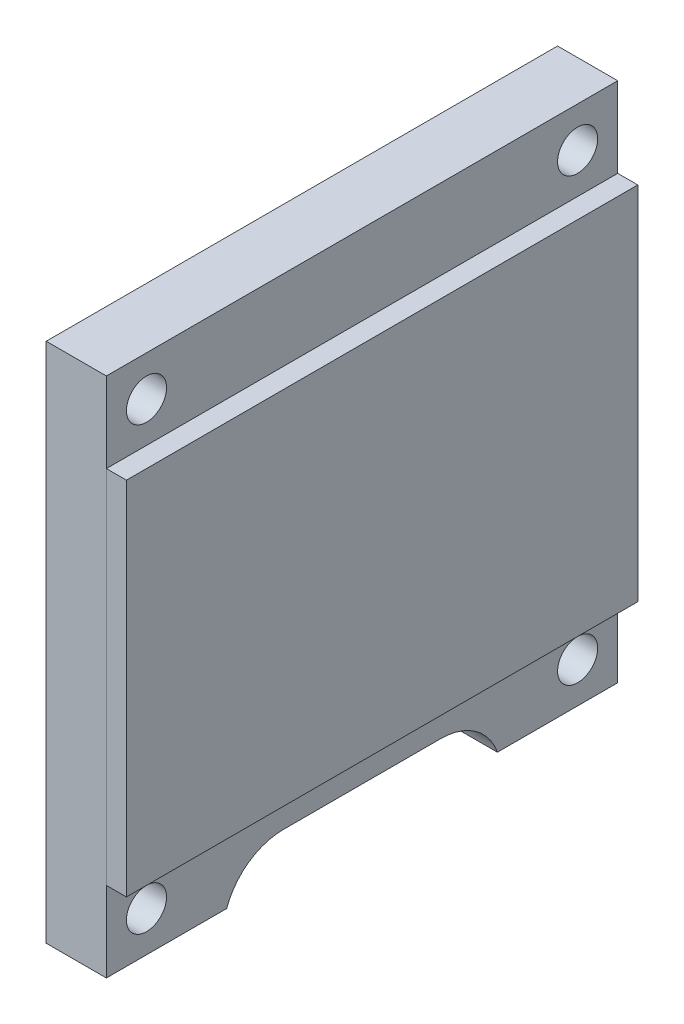
ISO-10303-21;
HEADER;
FILE_DESCRIPTION(('STEP AP214'),'2;1');
FILE_NAME('part.step','',(''),(''),'','','');
FILE_SCHEMA(('AUTOMOTIVE_DESIGN { 1 0 10303 214 1 1 1 1 }'));
ENDSEC;
DATA;
#1=APPLICATION_CONTEXT('core data for automotive mechanical design processes');
#2=APPLICATION_PROTOCOL_DEFINITION('international standard','automotive_design',2000,#1);
#3=PRODUCT_CONTEXT('',#1,'mechanical');
#4=PRODUCT('Part','Part','',(#3));
#5=PRODUCT_RELATED_PRODUCT_CATEGORY('part','',(#4));
#6=PRODUCT_DEFINITION_FORMATION('','',#4);
#7=PRODUCT_DEFINITION_CONTEXT('part definition',#1,'design');
#8=PRODUCT_DEFINITION('design','',#6,#7);
#9=PRODUCT_DEFINITION_SHAPE('','',#8);
#10=(LENGTH_UNIT() NAMED_UNIT(*) SI_UNIT(.MILLI.,.METRE.));
#11=(NAMED_UNIT(*) PLANE_ANGLE_UNIT() SI_UNIT($,.RADIAN.));
#12=(NAMED_UNIT(*) SI_UNIT($,.STERADIAN.) SOLID_ANGLE_UNIT());
#13=UNCERTAINTY_MEASURE_WITH_UNIT(LENGTH_MEASURE(1.E-05),#10,'distance_accuracy_value','');
#14=(GEOMETRIC_REPRESENTATION_CONTEXT(3) GLOBAL_UNCERTAINTY_ASSIGNED_CONTEXT((#13)) GLOBAL_UNIT_ASSIGNED_CONTEXT((#10,
#11,#12)) REPRESENTATION_CONTEXT('',''));
#15=CARTESIAN_POINT('',(0.,0.,0.));
#16=DIRECTION('',(0.,0.,1.));
#17=DIRECTION('',(1.,0.,0.));
#18=AXIS2_PLACEMENT_3D('',#15,#16,#17);
#19=CARTESIAN_POINT('',(4.,-9.,-12.75));
#20=DIRECTION('',(0.,0.,1.));
#21=DIRECTION('',(1.,0.,0.));
#22=AXIS2_PLACEMENT_3D('',#19,#20,#21);
#23=PLANE('',#22);
#24=DIRECTION('',(0.,1.,0.));
#25=VECTOR('',#24,1.);
#26=CARTESIAN_POINT('',(3.,-9.,-12.75));
#27=LINE('',#26,#25);
#28=CARTESIAN_POINT('',(3.,-9.,-12.75));
#29=VERTEX_POINT('',#28);
#30=CARTESIAN_POINT('',(3.,9.,-12.75));
#31=VERTEX_POINT('',#30);
#32=EDGE_CURVE('E116',#29,#31,#27,.T.);
#33=ORIENTED_EDGE('',*,*,#32,.T.);
#34=DIRECTION('',(-1.,0.,0.));
#35=VECTOR('',#34,1.);
#36=CARTESIAN_POINT('',(4.,9.,-12.75));
#37=LINE('',#36,#35);
#38=CARTESIAN_POINT('',(4.,9.,-12.75));
#39=VERTEX_POINT('',#38);
#40=EDGE_CURVE('E12',#39,#31,#37,.T.);
#41=ORIENTED_EDGE('',*,*,#40,.F.);
#42=DIRECTION('',(0.,1.,0.));
#43=VECTOR('',#42,1.);
#44=CARTESIAN_POINT('',(4.,-9.,-12.75));
#45=LINE('',#44,#43);
#46=CARTESIAN_POINT('',(4.,-9.,-12.75));
#47=VERTEX_POINT('',#46);
#48=EDGE_CURVE('E104',#47,#39,#45,.T.);
#49=ORIENTED_EDGE('',*,*,#48,.F.);
#50=DIRECTION('',(-1.,0.,0.));
#51=VECTOR('',#50,1.);
#52=CARTESIAN_POINT('',(4.,-9.,-12.75));
#53=LINE('',#52,#51);
#54=EDGE_CURVE('E112',#47,#29,#53,.T.);
#55=ORIENTED_EDGE('',*,*,#54,.T.);
#56=EDGE_LOOP('',(#33,#41,#49,#55));
#57=FACE_BOUND('',#56,.T.);
#58=ADVANCED_FACE('F53',(#57),#23,.F.);
#59=CARTESIAN_POINT('',(4.,9.,12.75));
#60=DIRECTION('',(0.,-1.,0.));
#61=DIRECTION('',(0.,0.,-1.));
#62=AXIS2_PLACEMENT_3D('',#59,#60,#61);
#63=PLANE('',#62);
#64=DIRECTION('',(0.,0.,1.));
#65=VECTOR('',#64,1.);
#66=CARTESIAN_POINT('',(3.,9.,12.75));
#67=LINE('',#66,#65);
#68=CARTESIAN_POINT('',(3.,9.,12.75));
#69=VERTEX_POINT('',#68);
#70=EDGE_CURVE('E108',#31,#69,#67,.T.);
#71=ORIENTED_EDGE('',*,*,#70,.T.);
#72=DIRECTION('',(-1.,0.,0.));
#73=VECTOR('',#72,1.);
#74=CARTESIAN_POINT('',(4.,9.,12.75));
#75=LINE('',#74,#73);
#76=CARTESIAN_POINT('',(4.,9.,12.75));
#77=VERTEX_POINT('',#76);
#78=EDGE_CURVE('E61',#77,#69,#75,.T.);
#79=ORIENTED_EDGE('',*,*,#78,.F.);
#80=DIRECTION('',(0.,0.,1.));
#81=VECTOR('',#80,1.);
#82=CARTESIAN_POINT('',(4.,9.,12.75));
#83=LINE('',#82,#81);
#84=EDGE_CURVE('E99',#39,#77,#83,.T.);
#85=ORIENTED_EDGE('',*,*,#84,.F.);
#86=ORIENTED_EDGE('',*,*,#40,.T.);
#87=EDGE_LOOP('',(#71,#79,#85,#86));
#88=FACE_BOUND('',#87,.T.);
#89=ADVANCED_FACE('F107',(#88),#63,.F.);
#90=CARTESIAN_POINT('',(4.,-9.,12.75));
#91=DIRECTION('',(0.,0.,-1.));
#92=DIRECTION('',(-1.,0.,0.));
#93=AXIS2_PLACEMENT_3D('',#90,#91,#92);
#94=PLANE('',#93);
#95=DIRECTION('',(0.,-1.,0.));
#96=VECTOR('',#95,1.);
#97=CARTESIAN_POINT('',(3.,-9.,12.75));
#98=LINE('',#97,#96);
#99=CARTESIAN_POINT('',(3.,-9.,12.75));
#100=VERTEX_POINT('',#99);
#101=EDGE_CURVE('E86',#69,#100,#98,.T.);
#102=ORIENTED_EDGE('',*,*,#101,.T.);
#103=DIRECTION('',(-1.,0.,0.));
#104=VECTOR('',#103,1.);
#105=CARTESIAN_POINT('',(4.,-9.,12.75));
#106=LINE('',#105,#104);
#107=CARTESIAN_POINT('',(4.,-9.,12.75));
#108=VERTEX_POINT('',#107);
#109=EDGE_CURVE('E109',#108,#100,#106,.T.);
#110=ORIENTED_EDGE('',*,*,#109,.F.);
#111=DIRECTION('',(0.,-1.,0.));
#112=VECTOR('',#111,1.);
#113=CARTESIAN_POINT('',(4.,-9.,12.75));
#114=LINE('',#113,#112);
#115=EDGE_CURVE('E102',#77,#108,#114,.T.);
#116=ORIENTED_EDGE('',*,*,#115,.F.);
#117=ORIENTED_EDGE('',*,*,#78,.T.);
#118=EDGE_LOOP('',(#102,#110,#116,#117));
#119=FACE_BOUND('',#118,.T.);
#120=ADVANCED_FACE('F110',(#119),#94,.F.);
#121=CARTESIAN_POINT('',(4.,-9.,12.75));
#122=DIRECTION('',(0.,1.,0.));
#123=DIRECTION('',(0.,0.,1.));
#124=AXIS2_PLACEMENT_3D('',#121,#122,#123);
#125=PLANE('',#124);
#126=DIRECTION('',(0.,0.,-1.));
#127=VECTOR('',#126,1.);
#128=CARTESIAN_POINT('',(3.,-9.,12.75));
#129=LINE('',#128,#127);
#130=EDGE_CURVE('E92',#100,#29,#129,.T.);
#131=ORIENTED_EDGE('',*,*,#130,.T.);
#132=ORIENTED_EDGE('',*,*,#54,.F.);
#133=DIRECTION('',(0.,0.,-1.));
#134=VECTOR('',#133,1.);
#135=CARTESIAN_POINT('',(4.,-9.,12.75));
#136=LINE('',#135,#134);
#137=EDGE_CURVE('E69',#108,#47,#136,.T.);
#138=ORIENTED_EDGE('',*,*,#137,.F.);
#139=ORIENTED_EDGE('',*,*,#109,.T.);
#140=EDGE_LOOP('',(#131,#132,#138,#139));
#141=FACE_BOUND('',#140,.T.);
#142=ADVANCED_FACE('F123',(#141),#125,.F.);
#143=CARTESIAN_POINT('',(4.,0.,0.));
#144=DIRECTION('',(-1.,0.,0.));
#145=DIRECTION('',(0.,0.,1.));
#146=AXIS2_PLACEMENT_3D('',#143,#144,#145);
#147=PLANE('',#146);
#148=ORIENTED_EDGE('',*,*,#48,.T.);
#149=ORIENTED_EDGE('',*,*,#84,.T.);
#150=ORIENTED_EDGE('',*,*,#115,.T.);
#151=ORIENTED_EDGE('',*,*,#137,.T.);
#152=EDGE_LOOP('',(#148,#149,#150,#151));
#153=FACE_BOUND('',#152,.T.);
#154=ADVANCED_FACE('F100',(#153),#147,.F.);
#155=CARTESIAN_POINT('',(3.,0.,0.));
#156=DIRECTION('',(-1.,0.,0.));
#157=DIRECTION('',(0.,0.,1.));
#158=AXIS2_PLACEMENT_3D('',#155,#156,#157);
#159=PLANE('',#158);
#160=ORIENTED_EDGE('',*,*,#32,.F.);
#161=ORIENTED_EDGE('',*,*,#130,.F.);
#162=ORIENTED_EDGE('',*,*,#101,.F.);
#163=ORIENTED_EDGE('',*,*,#70,.F.);
#164=EDGE_LOOP('',(#160,#161,#162,#163));
#165=FACE_BOUND('',#164,.T.);
#166=ADVANCED_FACE('F126',(#165),#159,.T.);
#167=CLOSED_SHELL('',(#58,#89,#120,#142,#154,#166));
#168=MANIFOLD_SOLID_BREP('B2',#167);
#169=CARTESIAN_POINT('',(3.,0.,0.));
#170=DIRECTION('',(-1.,0.,0.));
#171=DIRECTION('',(0.,0.,1.));
#172=AXIS2_PLACEMENT_3D('',#169,#170,#171);
#173=PLANE('',#172);
#174=DIRECTION('',(0.,1.,0.));
#175=VECTOR('',#174,1.);
#176=CARTESIAN_POINT('',(3.,-13.,-12.75));
#177=LINE('',#176,#175);
#178=CARTESIAN_POINT('',(3.,-13.,-12.75));
#179=VERTEX_POINT('',#178);
#180=CARTESIAN_POINT('',(3.,13.,-12.75));
#181=VERTEX_POINT('',#180);
#182=EDGE_CURVE('E264',#179,#181,#177,.T.);
#183=ORIENTED_EDGE('',*,*,#182,.T.);
#184=DIRECTION('',(0.,0.,1.));
#185=VECTOR('',#184,1.);
#186=CARTESIAN_POINT('',(3.,13.,12.75));
#187=LINE('',#186,#185);
#188=CARTESIAN_POINT('',(3.,13.,12.75));
#189=VERTEX_POINT('',#188);
#190=EDGE_CURVE('E254',#181,#189,#187,.T.);
#191=ORIENTED_EDGE('',*,*,#190,.T.);
#192=DIRECTION('',(0.,-1.,0.));
#193=VECTOR('',#192,1.);
#194=CARTESIAN_POINT('',(3.,-13.,12.75));
#195=LINE('',#194,#193);
#196=CARTESIAN_POINT('',(3.,-13.,12.75));
#197=VERTEX_POINT('',#196);
#198=EDGE_CURVE('E263',#189,#197,#195,.T.);
#199=ORIENTED_EDGE('',*,*,#198,.T.);
#200=DIRECTION('',(0.,0.,-1.));
#201=VECTOR('',#200,1.);
#202=CARTESIAN_POINT('',(3.,-13.,12.75));
#203=LINE('',#202,#201);
#204=CARTESIAN_POINT('',(3.,-13.,6.75));
#205=VERTEX_POINT('',#204);
#206=EDGE_CURVE('E310',#197,#205,#203,.T.);
#207=ORIENTED_EDGE('',*,*,#206,.T.);
#208=CARTESIAN_POINT('',(3.,-14.,3.92157287525381));
#209=DIRECTION('',(-1.,0.,0.));
#210=DIRECTION('',(0.,0.,1.));
#211=AXIS2_PLACEMENT_3D('',#208,#209,#210);
#212=CIRCLE('',#211,3.);
#213=CARTESIAN_POINT('',(3.,-11.,3.92157287525381));
#214=VERTEX_POINT('',#213);
#215=EDGE_CURVE('E211',#205,#214,#212,.T.);
#216=ORIENTED_EDGE('',*,*,#215,.T.);
#217=DIRECTION('',(0.,0.,-1.));
#218=VECTOR('',#217,1.);
#219=CARTESIAN_POINT('',(3.,-11.,6.75));
#220=LINE('',#219,#218);
#221=CARTESIAN_POINT('',(3.,-11.,-3.92157287525381));
#222=VERTEX_POINT('',#221);
#223=EDGE_CURVE('E304',#214,#222,#220,.T.);
#224=ORIENTED_EDGE('',*,*,#223,.T.);
#225=CARTESIAN_POINT('',(3.,-14.,-3.92157287525381));
#226=DIRECTION('',(-1.,0.,0.));
#227=DIRECTION('',(0.,0.,1.));
#228=AXIS2_PLACEMENT_3D('',#225,#226,#227);
#229=CIRCLE('',#228,3.);
#230=CARTESIAN_POINT('',(3.,-13.,-6.75));
#231=VERTEX_POINT('',#230);
#232=EDGE_CURVE('E51',#222,#231,#229,.T.);
#233=ORIENTED_EDGE('',*,*,#232,.T.);
#234=DIRECTION('',(0.,0.,-1.));
#235=VECTOR('',#234,1.);
#236=CARTESIAN_POINT('',(3.,-13.,-6.75));
#237=LINE('',#236,#235);
#238=EDGE_CURVE('E269',#231,#179,#237,.T.);
#239=ORIENTED_EDGE('',*,*,#238,.T.);
#240=EDGE_LOOP('',(#183,#191,#199,#207,#216,#224,#233,#239));
#241=FACE_BOUND('',#240,.T.);
#242=CARTESIAN_POINT('',(3.,-11.,10.75));
#243=DIRECTION('',(1.,0.,0.));
#244=DIRECTION('',(0.,0.,-1.));
#245=AXIS2_PLACEMENT_3D('',#242,#243,#244);
#246=CIRCLE('',#245,1.);
#247=CARTESIAN_POINT('',(3.,-11.,9.75));
#248=VERTEX_POINT('',#247);
#249=EDGE_CURVE('E316',#248,#248,#246,.T.);
#250=ORIENTED_EDGE('',*,*,#249,.F.);
#251=EDGE_LOOP('',(#250));
#252=FACE_BOUND('',#251,.T.);
#253=CARTESIAN_POINT('',(3.,11.,10.75));
#254=DIRECTION('',(1.,0.,0.));
#255=DIRECTION('',(0.,0.,-1.));
#256=AXIS2_PLACEMENT_3D('',#253,#254,#255);
#257=CIRCLE('',#256,1.);
#258=CARTESIAN_POINT('',(3.,11.,9.75));
#259=VERTEX_POINT('',#258);
#260=EDGE_CURVE('E501',#259,#259,#257,.T.);
#261=ORIENTED_EDGE('',*,*,#260,.F.);
#262=EDGE_LOOP('',(#261));
#263=FACE_BOUND('',#262,.T.);
#264=CARTESIAN_POINT('',(3.,11.,-10.75));
#265=DIRECTION('',(1.,0.,0.));
#266=DIRECTION('',(0.,0.,-1.));
#267=AXIS2_PLACEMENT_3D('',#264,#265,#266);
#268=CIRCLE('',#267,0.999999999999999);
#269=CARTESIAN_POINT('',(3.,11.,-11.75));
#270=VERTEX_POINT('',#269);
#271=EDGE_CURVE('E488',#270,#270,#268,.T.);
#272=ORIENTED_EDGE('',*,*,#271,.F.);
#273=EDGE_LOOP('',(#272));
#274=FACE_BOUND('',#273,.T.);
#275=CARTESIAN_POINT('',(3.,-11.,-10.75));
#276=DIRECTION('',(1.,0.,0.));
#277=DIRECTION('',(0.,0.,-1.));
#278=AXIS2_PLACEMENT_3D('',#275,#276,#277);
#279=CIRCLE('',#278,1.);
#280=CARTESIAN_POINT('',(3.,-11.,-11.75));
#281=VERTEX_POINT('',#280);
#282=EDGE_CURVE('E492',#281,#281,#279,.T.);
#283=ORIENTED_EDGE('',*,*,#282,.F.);
#284=EDGE_LOOP('',(#283));
#285=FACE_BOUND('',#284,.T.);
#286=ADVANCED_FACE('F189',(#241,#252,#263,#274,#285),#173,.F.);
#287=CARTESIAN_POINT('',(0.,0.,0.));
#288=DIRECTION('',(-1.,0.,0.));
#289=DIRECTION('',(0.,0.,1.));
#290=AXIS2_PLACEMENT_3D('',#287,#288,#289);
#291=PLANE('',#290);
#292=CARTESIAN_POINT('',(0.,11.,-10.75));
#293=DIRECTION('',(1.,0.,0.));
#294=DIRECTION('',(0.,0.,-1.));
#295=AXIS2_PLACEMENT_3D('',#292,#293,#294);
#296=CIRCLE('',#295,0.999999999999999);
#297=CARTESIAN_POINT('',(0.,11.,-11.75));
#298=VERTEX_POINT('',#297);
#299=EDGE_CURVE('E491',#298,#298,#296,.T.);
#300=ORIENTED_EDGE('',*,*,#299,.T.);
#301=EDGE_LOOP('',(#300));
#302=FACE_BOUND('',#301,.T.);
#303=CARTESIAN_POINT('',(0.,-11.,10.75));
#304=DIRECTION('',(1.,0.,0.));
#305=DIRECTION('',(0.,0.,-1.));
#306=AXIS2_PLACEMENT_3D('',#303,#304,#305);
#307=CIRCLE('',#306,1.);
#308=CARTESIAN_POINT('',(0.,-11.,9.75));
#309=VERTEX_POINT('',#308);
#310=EDGE_CURVE('E504',#309,#309,#307,.T.);
#311=ORIENTED_EDGE('',*,*,#310,.T.);
#312=EDGE_LOOP('',(#311));
#313=FACE_BOUND('',#312,.T.);
#314=DIRECTION('',(0.,1.,0.));
#315=VECTOR('',#314,1.);
#316=CARTESIAN_POINT('',(0.,-13.,-12.75));
#317=LINE('',#316,#315);
#318=CARTESIAN_POINT('',(0.,-13.,-12.75));
#319=VERTEX_POINT('',#318);
#320=CARTESIAN_POINT('',(0.,13.,-12.75));
#321=VERTEX_POINT('',#320);
#322=EDGE_CURVE('E277',#319,#321,#317,.T.);
#323=ORIENTED_EDGE('',*,*,#322,.F.);
#324=DIRECTION('',(0.,0.,-1.));
#325=VECTOR('',#324,1.);
#326=CARTESIAN_POINT('',(0.,-13.,-6.75));
#327=LINE('',#326,#325);
#328=CARTESIAN_POINT('',(0.,-13.,-6.75));
#329=VERTEX_POINT('',#328);
#330=EDGE_CURVE('E273',#329,#319,#327,.T.);
#331=ORIENTED_EDGE('',*,*,#330,.F.);
#332=CARTESIAN_POINT('',(0.,-14.,-3.92157287525381));
#333=DIRECTION('',(-1.,0.,0.));
#334=DIRECTION('',(0.,0.,1.));
#335=AXIS2_PLACEMENT_3D('',#332,#333,#334);
#336=CIRCLE('',#335,3.);
#337=CARTESIAN_POINT('',(0.,-11.,-3.92157287525381));
#338=VERTEX_POINT('',#337);
#339=EDGE_CURVE('E197',#329,#338,#336,.F.);
#340=ORIENTED_EDGE('',*,*,#339,.T.);
#341=DIRECTION('',(0.,0.,-1.));
#342=VECTOR('',#341,1.);
#343=CARTESIAN_POINT('',(0.,-11.,6.75));
#344=LINE('',#343,#342);
#345=CARTESIAN_POINT('',(0.,-11.,3.92157287525381));
#346=VERTEX_POINT('',#345);
#347=EDGE_CURVE('E294',#346,#338,#344,.T.);
#348=ORIENTED_EDGE('',*,*,#347,.F.);
#349=CARTESIAN_POINT('',(0.,-14.,3.92157287525381));
#350=DIRECTION('',(-1.,0.,0.));
#351=DIRECTION('',(0.,0.,1.));
#352=AXIS2_PLACEMENT_3D('',#349,#350,#351);
#353=CIRCLE('',#352,3.);
#354=CARTESIAN_POINT('',(0.,-13.,6.75));
#355=VERTEX_POINT('',#354);
#356=EDGE_CURVE('E287',#346,#355,#353,.F.);
#357=ORIENTED_EDGE('',*,*,#356,.T.);
#358=DIRECTION('',(0.,0.,-1.));
#359=VECTOR('',#358,1.);
#360=CARTESIAN_POINT('',(0.,-13.,12.75));
#361=LINE('',#360,#359);
#362=CARTESIAN_POINT('',(0.,-13.,12.75));
#363=VERTEX_POINT('',#362);
#364=EDGE_CURVE('E300',#363,#355,#361,.T.);
#365=ORIENTED_EDGE('',*,*,#364,.F.);
#366=DIRECTION('',(0.,-1.,0.));
#367=VECTOR('',#366,1.);
#368=CARTESIAN_POINT('',(0.,-13.,12.75));
#369=LINE('',#368,#367);
#370=CARTESIAN_POINT('',(0.,13.,12.75));
#371=VERTEX_POINT('',#370);
#372=EDGE_CURVE('E318',#371,#363,#369,.T.);
#373=ORIENTED_EDGE('',*,*,#372,.F.);
#374=DIRECTION('',(0.,0.,1.));
#375=VECTOR('',#374,1.);
#376=CARTESIAN_POINT('',(0.,13.,12.75));
#377=LINE('',#376,#375);
#378=EDGE_CURVE('E315',#321,#371,#377,.T.);
#379=ORIENTED_EDGE('',*,*,#378,.F.);
#380=EDGE_LOOP('',(#323,#331,#340,#348,#357,#365,#373,#379));
#381=FACE_BOUND('',#380,.T.);
#382=CARTESIAN_POINT('',(0.,11.,10.75));
#383=DIRECTION('',(1.,0.,0.));
#384=DIRECTION('',(0.,0.,-1.));
#385=AXIS2_PLACEMENT_3D('',#382,#383,#384);
#386=CIRCLE('',#385,1.);
#387=CARTESIAN_POINT('',(0.,11.,9.75));
#388=VERTEX_POINT('',#387);
#389=EDGE_CURVE('E494',#388,#388,#386,.T.);
#390=ORIENTED_EDGE('',*,*,#389,.T.);
#391=EDGE_LOOP('',(#390));
#392=FACE_BOUND('',#391,.T.);
#393=CARTESIAN_POINT('',(0.,-11.,-10.75));
#394=DIRECTION('',(1.,0.,0.));
#395=DIRECTION('',(0.,0.,-1.));
#396=AXIS2_PLACEMENT_3D('',#393,#394,#395);
#397=CIRCLE('',#396,1.);
#398=CARTESIAN_POINT('',(0.,-11.,-11.75));
#399=VERTEX_POINT('',#398);
#400=EDGE_CURVE('E497',#399,#399,#397,.T.);
#401=ORIENTED_EDGE('',*,*,#400,.T.);
#402=EDGE_LOOP('',(#401));
#403=FACE_BOUND('',#402,.T.);
#404=ADVANCED_FACE('F292',(#302,#313,#381,#392,#403),#291,.T.);
#405=CARTESIAN_POINT('',(3.,-13.,-12.75));
#406=DIRECTION('',(0.,0.,1.));
#407=DIRECTION('',(1.,0.,0.));
#408=AXIS2_PLACEMENT_3D('',#405,#406,#407);
#409=PLANE('',#408);
#410=ORIENTED_EDGE('',*,*,#322,.T.);
#411=DIRECTION('',(-1.,0.,0.));
#412=VECTOR('',#411,1.);
#413=CARTESIAN_POINT('',(3.,13.,-12.75));
#414=LINE('',#413,#412);
#415=EDGE_CURVE('E258',#181,#321,#414,.T.);
#416=ORIENTED_EDGE('',*,*,#415,.F.);
#417=ORIENTED_EDGE('',*,*,#182,.F.);
#418=DIRECTION('',(-1.,0.,0.));
#419=VECTOR('',#418,1.);
#420=CARTESIAN_POINT('',(3.,-13.,-12.75));
#421=LINE('',#420,#419);
#422=EDGE_CURVE('E307',#179,#319,#421,.T.);
#423=ORIENTED_EDGE('',*,*,#422,.T.);
#424=EDGE_LOOP('',(#410,#416,#417,#423));
#425=FACE_BOUND('',#424,.T.);
#426=ADVANCED_FACE('F275',(#425),#409,.F.);
#427=CARTESIAN_POINT('',(3.,13.,12.75));
#428=DIRECTION('',(0.,-1.,0.));
#429=DIRECTION('',(0.,0.,-1.));
#430=AXIS2_PLACEMENT_3D('',#427,#428,#429);
#431=PLANE('',#430);
#432=ORIENTED_EDGE('',*,*,#378,.T.);
#433=DIRECTION('',(-1.,0.,0.));
#434=VECTOR('',#433,1.);
#435=CARTESIAN_POINT('',(3.,13.,12.75));
#436=LINE('',#435,#434);
#437=EDGE_CURVE('E261',#189,#371,#436,.T.);
#438=ORIENTED_EDGE('',*,*,#437,.F.);
#439=ORIENTED_EDGE('',*,*,#190,.F.);
#440=ORIENTED_EDGE('',*,*,#415,.T.);
#441=EDGE_LOOP('',(#432,#438,#439,#440));
#442=FACE_BOUND('',#441,.T.);
#443=ADVANCED_FACE('F256',(#442),#431,.F.);
#444=CARTESIAN_POINT('',(3.,-13.,12.75));
#445=DIRECTION('',(0.,0.,-1.));
#446=DIRECTION('',(-1.,0.,0.));
#447=AXIS2_PLACEMENT_3D('',#444,#445,#446);
#448=PLANE('',#447);
#449=ORIENTED_EDGE('',*,*,#372,.T.);
#450=DIRECTION('',(-1.,0.,0.));
#451=VECTOR('',#450,1.);
#452=CARTESIAN_POINT('',(3.,-13.,12.75));
#453=LINE('',#452,#451);
#454=EDGE_CURVE('E281',#197,#363,#453,.T.);
#455=ORIENTED_EDGE('',*,*,#454,.F.);
#456=ORIENTED_EDGE('',*,*,#198,.F.);
#457=ORIENTED_EDGE('',*,*,#437,.T.);
#458=EDGE_LOOP('',(#449,#455,#456,#457));
#459=FACE_BOUND('',#458,.T.);
#460=ADVANCED_FACE('F364',(#459),#448,.F.);
#461=CARTESIAN_POINT('',(3.,-13.,12.75));
#462=DIRECTION('',(0.,1.,0.));
#463=DIRECTION('',(0.,0.,1.));
#464=AXIS2_PLACEMENT_3D('',#461,#462,#463);
#465=PLANE('',#464);
#466=ORIENTED_EDGE('',*,*,#364,.T.);
#467=DIRECTION('',(-1.,0.,0.));
#468=VECTOR('',#467,1.);
#469=CARTESIAN_POINT('',(3.,-13.,6.75));
#470=LINE('',#469,#468);
#471=EDGE_CURVE('E324',#205,#355,#470,.T.);
#472=ORIENTED_EDGE('',*,*,#471,.F.);
#473=ORIENTED_EDGE('',*,*,#206,.F.);
#474=ORIENTED_EDGE('',*,*,#454,.T.);
#475=EDGE_LOOP('',(#466,#472,#473,#474));
#476=FACE_BOUND('',#475,.T.);
#477=ADVANCED_FACE('F331',(#476),#465,.F.);
#478=CARTESIAN_POINT('',(3.,-11.,6.75));
#479=DIRECTION('',(0.,1.,0.));
#480=DIRECTION('',(0.,0.,1.));
#481=AXIS2_PLACEMENT_3D('',#478,#479,#480);
#482=PLANE('',#481);
#483=ORIENTED_EDGE('',*,*,#223,.F.);
#484=DIRECTION('',(-1.,0.,0.));
#485=VECTOR('',#484,1.);
#486=CARTESIAN_POINT('',(3.,-11.,3.92157287525381));
#487=LINE('',#486,#485);
#488=EDGE_CURVE('E279',#214,#346,#487,.T.);
#489=ORIENTED_EDGE('',*,*,#488,.T.);
#490=ORIENTED_EDGE('',*,*,#347,.T.);
#491=DIRECTION('',(1.,0.,0.));
#492=VECTOR('',#491,1.);
#493=CARTESIAN_POINT('',(3.,-11.,-3.92157287525381));
#494=LINE('',#493,#492);
#495=EDGE_CURVE('E204',#338,#222,#494,.T.);
#496=ORIENTED_EDGE('',*,*,#495,.T.);
#497=EDGE_LOOP('',(#483,#489,#490,#496));
#498=FACE_BOUND('',#497,.T.);
#499=ADVANCED_FACE('F298',(#498),#482,.F.);
#500=CARTESIAN_POINT('',(3.,-13.,-6.75));
#501=DIRECTION('',(0.,1.,0.));
#502=DIRECTION('',(0.,0.,1.));
#503=AXIS2_PLACEMENT_3D('',#500,#501,#502);
#504=PLANE('',#503);
#505=ORIENTED_EDGE('',*,*,#330,.T.);
#506=ORIENTED_EDGE('',*,*,#422,.F.);
#507=ORIENTED_EDGE('',*,*,#238,.F.);
#508=DIRECTION('',(-1.,0.,0.));
#509=VECTOR('',#508,1.);
#510=CARTESIAN_POINT('',(3.,-13.,-6.75));
#511=LINE('',#510,#509);
#512=EDGE_CURVE('E303',#231,#329,#511,.T.);
#513=ORIENTED_EDGE('',*,*,#512,.T.);
#514=EDGE_LOOP('',(#505,#506,#507,#513));
#515=FACE_BOUND('',#514,.T.);
#516=ADVANCED_FACE('F306',(#515),#504,.F.);
#517=CARTESIAN_POINT('',(3.,-11.,10.75));
#518=DIRECTION('',(-1.,0.,0.));
#519=DIRECTION('',(0.,0.,1.));
#520=AXIS2_PLACEMENT_3D('',#517,#518,#519);
#521=CYLINDRICAL_SURFACE('',#520,1.);
#522=ORIENTED_EDGE('',*,*,#249,.T.);
#523=EDGE_LOOP('',(#522));
#524=FACE_BOUND('',#523,.T.);
#525=ORIENTED_EDGE('',*,*,#310,.F.);
#526=EDGE_LOOP('',(#525));
#527=FACE_BOUND('',#526,.T.);
#528=ADVANCED_FACE('F355',(#524,#527),#521,.F.);
#529=CARTESIAN_POINT('',(3.,11.,10.75));
#530=DIRECTION('',(-1.,0.,0.));
#531=DIRECTION('',(0.,0.,1.));
#532=AXIS2_PLACEMENT_3D('',#529,#530,#531);
#533=CYLINDRICAL_SURFACE('',#532,1.);
#534=ORIENTED_EDGE('',*,*,#260,.T.);
#535=EDGE_LOOP('',(#534));
#536=FACE_BOUND('',#535,.T.);
#537=ORIENTED_EDGE('',*,*,#389,.F.);
#538=EDGE_LOOP('',(#537));
#539=FACE_BOUND('',#538,.T.);
#540=ADVANCED_FACE('F399',(#536,#539),#533,.F.);
#541=CARTESIAN_POINT('',(3.,11.,-10.75));
#542=DIRECTION('',(-1.,0.,0.));
#543=DIRECTION('',(0.,0.,1.));
#544=AXIS2_PLACEMENT_3D('',#541,#542,#543);
#545=CYLINDRICAL_SURFACE('',#544,0.999999999999999);
#546=ORIENTED_EDGE('',*,*,#271,.T.);
#547=EDGE_LOOP('',(#546));
#548=FACE_BOUND('',#547,.T.);
#549=ORIENTED_EDGE('',*,*,#299,.F.);
#550=EDGE_LOOP('',(#549));
#551=FACE_BOUND('',#550,.T.);
#552=ADVANCED_FACE('F343',(#548,#551),#545,.F.);
#553=CARTESIAN_POINT('',(3.,-11.,-10.75));
#554=DIRECTION('',(-1.,0.,0.));
#555=DIRECTION('',(0.,0.,1.));
#556=AXIS2_PLACEMENT_3D('',#553,#554,#555);
#557=CYLINDRICAL_SURFACE('',#556,1.);
#558=ORIENTED_EDGE('',*,*,#282,.T.);
#559=EDGE_LOOP('',(#558));
#560=FACE_BOUND('',#559,.T.);
#561=ORIENTED_EDGE('',*,*,#400,.F.);
#562=EDGE_LOOP('',(#561));
#563=FACE_BOUND('',#562,.T.);
#564=ADVANCED_FACE('F338',(#560,#563),#557,.F.);
#565=CARTESIAN_POINT('',(3.,-14.,3.92157287525381));
#566=DIRECTION('',(-1.,0.,0.));
#567=DIRECTION('',(0.,0.,1.));
#568=AXIS2_PLACEMENT_3D('',#565,#566,#567);
#569=CYLINDRICAL_SURFACE('',#568,3.);
#570=ORIENTED_EDGE('',*,*,#215,.F.);
#571=ORIENTED_EDGE('',*,*,#471,.T.);
#572=ORIENTED_EDGE('',*,*,#356,.F.);
#573=ORIENTED_EDGE('',*,*,#488,.F.);
#574=EDGE_LOOP('',(#570,#571,#572,#573));
#575=FACE_BOUND('',#574,.T.);
#576=ADVANCED_FACE('F336',(#575),#569,.F.);
#577=CARTESIAN_POINT('',(3.,-14.,-3.92157287525381));
#578=DIRECTION('',(1.,0.,0.));
#579=DIRECTION('',(0.,0.,-1.));
#580=AXIS2_PLACEMENT_3D('',#577,#578,#579);
#581=CYLINDRICAL_SURFACE('',#580,3.);
#582=ORIENTED_EDGE('',*,*,#232,.F.);
#583=ORIENTED_EDGE('',*,*,#495,.F.);
#584=ORIENTED_EDGE('',*,*,#339,.F.);
#585=ORIENTED_EDGE('',*,*,#512,.F.);
#586=EDGE_LOOP('',(#582,#583,#584,#585));
#587=FACE_BOUND('',#586,.T.);
#588=ADVANCED_FACE('F191',(#587),#581,.F.);
#589=CLOSED_SHELL('',(#286,#404,#426,#443,#460,#477,#499,#516,#528,#540,#552,#564,#576,#588));
#590=MANIFOLD_SOLID_BREP('B6',#589);
#591=ADVANCED_BREP_SHAPE_REPRESENTATION('',(#18,#168,#590),#14);
#592=SHAPE_DEFINITION_REPRESENTATION(#9,#591);
ENDSEC;
END-ISO-10303-21;
